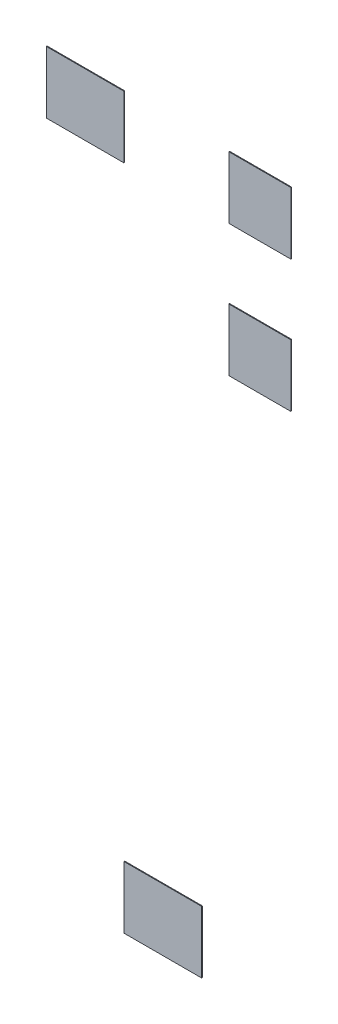
ISO-10303-21;
HEADER;
FILE_DESCRIPTION(('STEP AP214'),'2;1');
FILE_NAME('part.step','',(''),(''),'','','');
FILE_SCHEMA(('AUTOMOTIVE_DESIGN { 1 0 10303 214 1 1 1 1 }'));
ENDSEC;
DATA;
#1=APPLICATION_CONTEXT('core data for automotive mechanical design processes');
#2=APPLICATION_PROTOCOL_DEFINITION('international standard','automotive_design',2000,#1);
#3=PRODUCT_CONTEXT('',#1,'mechanical');
#4=PRODUCT('Part','Part','',(#3));
#5=PRODUCT_RELATED_PRODUCT_CATEGORY('part','',(#4));
#6=PRODUCT_DEFINITION_FORMATION('','',#4);
#7=PRODUCT_DEFINITION_CONTEXT('part definition',#1,'design');
#8=PRODUCT_DEFINITION('design','',#6,#7);
#9=PRODUCT_DEFINITION_SHAPE('','',#8);
#10=(LENGTH_UNIT() NAMED_UNIT(*) SI_UNIT(.MILLI.,.METRE.));
#11=(NAMED_UNIT(*) PLANE_ANGLE_UNIT() SI_UNIT($,.RADIAN.));
#12=(NAMED_UNIT(*) SI_UNIT($,.STERADIAN.) SOLID_ANGLE_UNIT());
#13=UNCERTAINTY_MEASURE_WITH_UNIT(LENGTH_MEASURE(1.E-05),#10,'distance_accuracy_value','');
#14=(GEOMETRIC_REPRESENTATION_CONTEXT(3) GLOBAL_UNCERTAINTY_ASSIGNED_CONTEXT((#13)) GLOBAL_UNIT_ASSIGNED_CONTEXT((#10,
#11,#12)) REPRESENTATION_CONTEXT('',''));
#15=CARTESIAN_POINT('',(0.,0.,0.));
#16=DIRECTION('',(0.,0.,1.));
#17=DIRECTION('',(1.,0.,0.));
#18=AXIS2_PLACEMENT_3D('',#15,#16,#17);
#19=CARTESIAN_POINT('',(-1.2,-2.,0.));
#20=DIRECTION('',(0.,0.,1.));
#21=DIRECTION('',(1.,0.,0.));
#22=AXIS2_PLACEMENT_3D('',#19,#20,#21);
#23=PLANE('',#22);
#24=DIRECTION('',(0.,1.,0.));
#25=VECTOR('',#24,1.);
#26=CARTESIAN_POINT('',(-0.4,-2.8,0.));
#27=LINE('',#26,#25);
#28=CARTESIAN_POINT('',(-0.4,-2.,0.));
#29=VERTEX_POINT('',#28);
#30=CARTESIAN_POINT('',(-0.4,-2.8,0.));
#31=VERTEX_POINT('',#30);
#32=EDGE_CURVE('P0_E81',#29,#31,#27,.F.);
#33=ORIENTED_EDGE('',*,*,#32,.T.);
#34=DIRECTION('',(1.,0.,0.));
#35=VECTOR('',#34,1.);
#36=CARTESIAN_POINT('',(-1.2,-2.8,0.));
#37=LINE('',#36,#35);
#38=CARTESIAN_POINT('',(-1.2,-2.8,0.));
#39=VERTEX_POINT('',#38);
#40=EDGE_CURVE('P0_E68',#31,#39,#37,.F.);
#41=ORIENTED_EDGE('',*,*,#40,.T.);
#42=DIRECTION('',(0.,1.,0.));
#43=VECTOR('',#42,1.);
#44=CARTESIAN_POINT('',(-1.2,-2.,0.));
#45=LINE('',#44,#43);
#46=CARTESIAN_POINT('',(-1.2,-2.,0.));
#47=VERTEX_POINT('',#46);
#48=EDGE_CURVE('P0_E55',#39,#47,#45,.T.);
#49=ORIENTED_EDGE('',*,*,#48,.T.);
#50=DIRECTION('',(1.,0.,0.));
#51=VECTOR('',#50,1.);
#52=CARTESIAN_POINT('',(-0.4,-2.,0.));
#53=LINE('',#52,#51);
#54=EDGE_CURVE('P0_E20',#47,#29,#53,.T.);
#55=ORIENTED_EDGE('',*,*,#54,.T.);
#56=EDGE_LOOP('',(#33,#41,#49,#55));
#57=FACE_BOUND('',#56,.T.);
#58=ADVANCED_FACE('P0_F17',(#57),#23,.F.);
#59=CARTESIAN_POINT('',(-0.4,-2.,0.01));
#60=DIRECTION('',(0.,-1.,0.));
#61=DIRECTION('',(0.,0.,-1.));
#62=AXIS2_PLACEMENT_3D('',#59,#60,#61);
#63=PLANE('',#62);
#64=DIRECTION('',(0.,0.,-1.));
#65=VECTOR('',#64,1.);
#66=CARTESIAN_POINT('',(-1.2,-2.,0.01));
#67=LINE('',#66,#65);
#68=CARTESIAN_POINT('',(-1.2,-2.,0.01));
#69=VERTEX_POINT('',#68);
#70=EDGE_CURVE('P0_E61',#47,#69,#67,.F.);
#71=ORIENTED_EDGE('',*,*,#70,.T.);
#72=DIRECTION('',(1.,0.,0.));
#73=VECTOR('',#72,1.);
#74=CARTESIAN_POINT('',(-1.2,-2.,0.01));
#75=LINE('',#74,#73);
#76=CARTESIAN_POINT('',(-0.4,-2.,0.01));
#77=VERTEX_POINT('',#76);
#78=EDGE_CURVE('P0_E83',#77,#69,#75,.F.);
#79=ORIENTED_EDGE('',*,*,#78,.F.);
#80=DIRECTION('',(0.,0.,1.));
#81=VECTOR('',#80,1.);
#82=CARTESIAN_POINT('',(-0.4,-2.,0.01));
#83=LINE('',#82,#81);
#84=EDGE_CURVE('P0_E64',#77,#29,#83,.F.);
#85=ORIENTED_EDGE('',*,*,#84,.T.);
#86=ORIENTED_EDGE('',*,*,#54,.F.);
#87=EDGE_LOOP('',(#71,#79,#85,#86));
#88=FACE_BOUND('',#87,.T.);
#89=ADVANCED_FACE('P0_F60',(#88),#63,.F.);
#90=CARTESIAN_POINT('',(-1.2,-2.,0.01));
#91=DIRECTION('',(1.,0.,0.));
#92=DIRECTION('',(0.,0.,-1.));
#93=AXIS2_PLACEMENT_3D('',#90,#91,#92);
#94=PLANE('',#93);
#95=DIRECTION('',(0.,0.,1.));
#96=VECTOR('',#95,1.);
#97=CARTESIAN_POINT('',(-1.2,-2.8,0.01));
#98=LINE('',#97,#96);
#99=CARTESIAN_POINT('',(-1.2,-2.8,0.01));
#100=VERTEX_POINT('',#99);
#101=EDGE_CURVE('P0_E70',#39,#100,#98,.T.);
#102=ORIENTED_EDGE('',*,*,#101,.T.);
#103=DIRECTION('',(0.,1.,0.));
#104=VECTOR('',#103,1.);
#105=CARTESIAN_POINT('',(-1.2,-2.,0.01));
#106=LINE('',#105,#104);
#107=EDGE_CURVE('P0_E74',#69,#100,#106,.F.);
#108=ORIENTED_EDGE('',*,*,#107,.F.);
#109=ORIENTED_EDGE('',*,*,#70,.F.);
#110=ORIENTED_EDGE('',*,*,#48,.F.);
#111=EDGE_LOOP('',(#102,#108,#109,#110));
#112=FACE_BOUND('',#111,.T.);
#113=ADVANCED_FACE('P0_F72',(#112),#94,.F.);
#114=CARTESIAN_POINT('',(-1.2,-2.8,0.01));
#115=DIRECTION('',(0.,1.,0.));
#116=DIRECTION('',(0.,0.,1.));
#117=AXIS2_PLACEMENT_3D('',#114,#115,#116);
#118=PLANE('',#117);
#119=DIRECTION('',(0.,0.,1.));
#120=VECTOR('',#119,1.);
#121=CARTESIAN_POINT('',(-0.4,-2.8,0.01));
#122=LINE('',#121,#120);
#123=CARTESIAN_POINT('',(-0.4,-2.8,0.01));
#124=VERTEX_POINT('',#123);
#125=EDGE_CURVE('P0_E35',#31,#124,#122,.T.);
#126=ORIENTED_EDGE('',*,*,#125,.T.);
#127=DIRECTION('',(1.,0.,0.));
#128=VECTOR('',#127,1.);
#129=CARTESIAN_POINT('',(-1.2,-2.8,0.01));
#130=LINE('',#129,#128);
#131=EDGE_CURVE('P0_E26',#100,#124,#130,.T.);
#132=ORIENTED_EDGE('',*,*,#131,.F.);
#133=ORIENTED_EDGE('',*,*,#101,.F.);
#134=ORIENTED_EDGE('',*,*,#40,.F.);
#135=EDGE_LOOP('',(#126,#132,#133,#134));
#136=FACE_BOUND('',#135,.T.);
#137=ADVANCED_FACE('P0_F89',(#136),#118,.F.);
#138=CARTESIAN_POINT('',(-0.4,-2.8,0.01));
#139=DIRECTION('',(-1.,0.,0.));
#140=DIRECTION('',(0.,0.,1.));
#141=AXIS2_PLACEMENT_3D('',#138,#139,#140);
#142=PLANE('',#141);
#143=ORIENTED_EDGE('',*,*,#84,.F.);
#144=DIRECTION('',(0.,1.,0.));
#145=VECTOR('',#144,1.);
#146=CARTESIAN_POINT('',(-0.4,-2.,0.01));
#147=LINE('',#146,#145);
#148=EDGE_CURVE('P0_E11',#124,#77,#147,.T.);
#149=ORIENTED_EDGE('',*,*,#148,.F.);
#150=ORIENTED_EDGE('',*,*,#125,.F.);
#151=ORIENTED_EDGE('',*,*,#32,.F.);
#152=EDGE_LOOP('',(#143,#149,#150,#151));
#153=FACE_BOUND('',#152,.T.);
#154=ADVANCED_FACE('P0_F91',(#153),#142,.F.);
#155=CARTESIAN_POINT('',(-1.2,-2.,0.01));
#156=DIRECTION('',(0.,0.,1.));
#157=DIRECTION('',(1.,0.,0.));
#158=AXIS2_PLACEMENT_3D('',#155,#156,#157);
#159=PLANE('',#158);
#160=ORIENTED_EDGE('',*,*,#131,.T.);
#161=ORIENTED_EDGE('',*,*,#148,.T.);
#162=ORIENTED_EDGE('',*,*,#78,.T.);
#163=ORIENTED_EDGE('',*,*,#107,.T.);
#164=EDGE_LOOP('',(#160,#161,#162,#163));
#165=FACE_BOUND('',#164,.T.);
#166=ADVANCED_FACE('P0_F88',(#165),#159,.T.);
#167=CLOSED_SHELL('',(#58,#89,#113,#137,#154,#166));
#168=MANIFOLD_SOLID_BREP('P0_B1',#167);
#169=CARTESIAN_POINT('',(-3.55,-1.1,0.001000000000015));
#170=DIRECTION('',(0.,0.,1.));
#171=DIRECTION('',(1.,0.,0.));
#172=AXIS2_PLACEMENT_3D('',#169,#170,#171);
#173=PLANE('',#172);
#174=DIRECTION('',(1.,0.,0.));
#175=VECTOR('',#174,1.);
#176=CARTESIAN_POINT('',(-2.55,-0.3,0.001000000000015));
#177=LINE('',#176,#175);
#178=CARTESIAN_POINT('',(-3.55,-0.3,0.001000000000015));
#179=VERTEX_POINT('',#178);
#180=CARTESIAN_POINT('',(-2.55,-0.3,0.001000000000015));
#181=VERTEX_POINT('',#180);
#182=EDGE_CURVE('P1_E81',#179,#181,#177,.T.);
#183=ORIENTED_EDGE('',*,*,#182,.T.);
#184=DIRECTION('',(0.,1.,0.));
#185=VECTOR('',#184,1.);
#186=CARTESIAN_POINT('',(-2.55,-1.1,0.001000000000015));
#187=LINE('',#186,#185);
#188=CARTESIAN_POINT('',(-2.55,-1.1,0.001000000000015));
#189=VERTEX_POINT('',#188);
#190=EDGE_CURVE('P1_E68',#181,#189,#187,.F.);
#191=ORIENTED_EDGE('',*,*,#190,.T.);
#192=DIRECTION('',(1.,0.,0.));
#193=VECTOR('',#192,1.);
#194=CARTESIAN_POINT('',(-3.55,-1.1,0.001000000000015));
#195=LINE('',#194,#193);
#196=CARTESIAN_POINT('',(-3.55,-1.1,0.001000000000015));
#197=VERTEX_POINT('',#196);
#198=EDGE_CURVE('P1_E55',#189,#197,#195,.F.);
#199=ORIENTED_EDGE('',*,*,#198,.T.);
#200=DIRECTION('',(0.,1.,0.));
#201=VECTOR('',#200,1.);
#202=CARTESIAN_POINT('',(-3.55,-0.3,0.001000000000015));
#203=LINE('',#202,#201);
#204=EDGE_CURVE('P1_E20',#197,#179,#203,.T.);
#205=ORIENTED_EDGE('',*,*,#204,.T.);
#206=EDGE_LOOP('',(#183,#191,#199,#205));
#207=FACE_BOUND('',#206,.T.);
#208=ADVANCED_FACE('P1_F17',(#207),#173,.F.);
#209=CARTESIAN_POINT('',(-3.55,-0.3,0.01100000000001));
#210=DIRECTION('',(1.,0.,0.));
#211=DIRECTION('',(0.,0.,-1.));
#212=AXIS2_PLACEMENT_3D('',#209,#210,#211);
#213=PLANE('',#212);
#214=DIRECTION('',(0.,0.,1.));
#215=VECTOR('',#214,1.);
#216=CARTESIAN_POINT('',(-3.55,-1.1,0.01100000000001));
#217=LINE('',#216,#215);
#218=CARTESIAN_POINT('',(-3.55,-1.1,0.01100000000001));
#219=VERTEX_POINT('',#218);
#220=EDGE_CURVE('P1_E61',#197,#219,#217,.T.);
#221=ORIENTED_EDGE('',*,*,#220,.T.);
#222=DIRECTION('',(0.,1.,0.));
#223=VECTOR('',#222,1.);
#224=CARTESIAN_POINT('',(-3.55,-1.1,0.01100000000001));
#225=LINE('',#224,#223);
#226=CARTESIAN_POINT('',(-3.55,-0.3,0.01100000000001));
#227=VERTEX_POINT('',#226);
#228=EDGE_CURVE('P1_E83',#227,#219,#225,.F.);
#229=ORIENTED_EDGE('',*,*,#228,.F.);
#230=DIRECTION('',(0.,0.,-1.));
#231=VECTOR('',#230,1.);
#232=CARTESIAN_POINT('',(-3.55,-0.3,0.01100000000001));
#233=LINE('',#232,#231);
#234=EDGE_CURVE('P1_E64',#227,#179,#233,.T.);
#235=ORIENTED_EDGE('',*,*,#234,.T.);
#236=ORIENTED_EDGE('',*,*,#204,.F.);
#237=EDGE_LOOP('',(#221,#229,#235,#236));
#238=FACE_BOUND('',#237,.T.);
#239=ADVANCED_FACE('P1_F60',(#238),#213,.F.);
#240=CARTESIAN_POINT('',(-3.55,-1.1,0.01100000000001));
#241=DIRECTION('',(0.,1.,0.));
#242=DIRECTION('',(0.,0.,1.));
#243=AXIS2_PLACEMENT_3D('',#240,#241,#242);
#244=PLANE('',#243);
#245=DIRECTION('',(0.,0.,1.));
#246=VECTOR('',#245,1.);
#247=CARTESIAN_POINT('',(-2.55,-1.1,0.01100000000001));
#248=LINE('',#247,#246);
#249=CARTESIAN_POINT('',(-2.55,-1.1,0.01100000000001));
#250=VERTEX_POINT('',#249);
#251=EDGE_CURVE('P1_E70',#189,#250,#248,.T.);
#252=ORIENTED_EDGE('',*,*,#251,.T.);
#253=DIRECTION('',(1.,0.,0.));
#254=VECTOR('',#253,1.);
#255=CARTESIAN_POINT('',(-3.55,-1.1,0.01100000000001));
#256=LINE('',#255,#254);
#257=EDGE_CURVE('P1_E74',#219,#250,#256,.T.);
#258=ORIENTED_EDGE('',*,*,#257,.F.);
#259=ORIENTED_EDGE('',*,*,#220,.F.);
#260=ORIENTED_EDGE('',*,*,#198,.F.);
#261=EDGE_LOOP('',(#252,#258,#259,#260));
#262=FACE_BOUND('',#261,.T.);
#263=ADVANCED_FACE('P1_F72',(#262),#244,.F.);
#264=CARTESIAN_POINT('',(-2.55,-1.1,0.01100000000001));
#265=DIRECTION('',(-1.,0.,0.));
#266=DIRECTION('',(0.,0.,1.));
#267=AXIS2_PLACEMENT_3D('',#264,#265,#266);
#268=PLANE('',#267);
#269=DIRECTION('',(0.,0.,-1.));
#270=VECTOR('',#269,1.);
#271=CARTESIAN_POINT('',(-2.55,-0.3,0.01100000000001));
#272=LINE('',#271,#270);
#273=CARTESIAN_POINT('',(-2.55,-0.3,0.01100000000001));
#274=VERTEX_POINT('',#273);
#275=EDGE_CURVE('P1_E35',#181,#274,#272,.F.);
#276=ORIENTED_EDGE('',*,*,#275,.T.);
#277=DIRECTION('',(0.,1.,0.));
#278=VECTOR('',#277,1.);
#279=CARTESIAN_POINT('',(-2.55,-1.1,0.01100000000001));
#280=LINE('',#279,#278);
#281=EDGE_CURVE('P1_E26',#250,#274,#280,.T.);
#282=ORIENTED_EDGE('',*,*,#281,.F.);
#283=ORIENTED_EDGE('',*,*,#251,.F.);
#284=ORIENTED_EDGE('',*,*,#190,.F.);
#285=EDGE_LOOP('',(#276,#282,#283,#284));
#286=FACE_BOUND('',#285,.T.);
#287=ADVANCED_FACE('P1_F89',(#286),#268,.F.);
#288=CARTESIAN_POINT('',(-2.55,-0.3,0.01100000000001));
#289=DIRECTION('',(0.,-1.,0.));
#290=DIRECTION('',(0.,0.,-1.));
#291=AXIS2_PLACEMENT_3D('',#288,#289,#290);
#292=PLANE('',#291);
#293=ORIENTED_EDGE('',*,*,#234,.F.);
#294=DIRECTION('',(1.,0.,0.));
#295=VECTOR('',#294,1.);
#296=CARTESIAN_POINT('',(-3.55,-0.3,0.01100000000001));
#297=LINE('',#296,#295);
#298=EDGE_CURVE('P1_E11',#274,#227,#297,.F.);
#299=ORIENTED_EDGE('',*,*,#298,.F.);
#300=ORIENTED_EDGE('',*,*,#275,.F.);
#301=ORIENTED_EDGE('',*,*,#182,.F.);
#302=EDGE_LOOP('',(#293,#299,#300,#301));
#303=FACE_BOUND('',#302,.T.);
#304=ADVANCED_FACE('P1_F91',(#303),#292,.F.);
#305=CARTESIAN_POINT('',(-3.55,-1.1,0.01100000000001));
#306=DIRECTION('',(0.,0.,1.));
#307=DIRECTION('',(1.,0.,0.));
#308=AXIS2_PLACEMENT_3D('',#305,#306,#307);
#309=PLANE('',#308);
#310=ORIENTED_EDGE('',*,*,#281,.T.);
#311=ORIENTED_EDGE('',*,*,#298,.T.);
#312=ORIENTED_EDGE('',*,*,#228,.T.);
#313=ORIENTED_EDGE('',*,*,#257,.T.);
#314=EDGE_LOOP('',(#310,#311,#312,#313));
#315=FACE_BOUND('',#314,.T.);
#316=ADVANCED_FACE('P1_F88',(#315),#309,.T.);
#317=CLOSED_SHELL('',(#208,#239,#263,#287,#304,#316));
#318=MANIFOLD_SOLID_BREP('P1_B1',#317);
#319=CARTESIAN_POINT('',(-1.2,-0.3,0.01));
#320=DIRECTION('',(0.,0.,1.));
#321=DIRECTION('',(1.,0.,0.));
#322=AXIS2_PLACEMENT_3D('',#319,#320,#321);
#323=PLANE('',#322);
#324=DIRECTION('',(1.,0.,0.));
#325=VECTOR('',#324,1.);
#326=CARTESIAN_POINT('',(-1.2,-1.1,0.01));
#327=LINE('',#326,#325);
#328=CARTESIAN_POINT('',(-1.2,-1.1,0.01));
#329=VERTEX_POINT('',#328);
#330=CARTESIAN_POINT('',(-0.4,-1.1,0.01));
#331=VERTEX_POINT('',#330);
#332=EDGE_CURVE('P2_E55',#329,#331,#327,.T.);
#333=ORIENTED_EDGE('',*,*,#332,.T.);
#334=DIRECTION('',(0.,1.,0.));
#335=VECTOR('',#334,1.);
#336=CARTESIAN_POINT('',(-0.4,-1.1,0.01));
#337=LINE('',#336,#335);
#338=CARTESIAN_POINT('',(-0.4,-0.3,0.01));
#339=VERTEX_POINT('',#338);
#340=EDGE_CURVE('P2_E76',#331,#339,#337,.T.);
#341=ORIENTED_EDGE('',*,*,#340,.T.);
#342=DIRECTION('',(1.,0.,0.));
#343=VECTOR('',#342,1.);
#344=CARTESIAN_POINT('',(-0.4,-0.3,0.01));
#345=LINE('',#344,#343);
#346=CARTESIAN_POINT('',(-1.2,-0.3,0.01));
#347=VERTEX_POINT('',#346);
#348=EDGE_CURVE('P2_E58',#339,#347,#345,.F.);
#349=ORIENTED_EDGE('',*,*,#348,.T.);
#350=DIRECTION('',(0.,1.,0.));
#351=VECTOR('',#350,1.);
#352=CARTESIAN_POINT('',(-1.2,-0.3,0.01));
#353=LINE('',#352,#351);
#354=EDGE_CURVE('P2_E20',#347,#329,#353,.F.);
#355=ORIENTED_EDGE('',*,*,#354,.T.);
#356=EDGE_LOOP('',(#333,#341,#349,#355));
#357=FACE_BOUND('',#356,.T.);
#358=ADVANCED_FACE('P2_F17',(#357),#323,.T.);
#359=CARTESIAN_POINT('',(-1.2,-0.3,0.01));
#360=DIRECTION('',(1.,0.,0.));
#361=DIRECTION('',(0.,0.,-1.));
#362=AXIS2_PLACEMENT_3D('',#359,#360,#361);
#363=PLANE('',#362);
#364=DIRECTION('',(0.,0.,1.));
#365=VECTOR('',#364,1.);
#366=CARTESIAN_POINT('',(-1.2,-1.1,0.01));
#367=LINE('',#366,#365);
#368=CARTESIAN_POINT('',(-1.2,-1.1,0.));
#369=VERTEX_POINT('',#368);
#370=EDGE_CURVE('P2_E63',#369,#329,#367,.T.);
#371=ORIENTED_EDGE('',*,*,#370,.T.);
#372=ORIENTED_EDGE('',*,*,#354,.F.);
#373=DIRECTION('',(0.,0.,-1.));
#374=VECTOR('',#373,1.);
#375=CARTESIAN_POINT('',(-1.2,-0.3,0.01));
#376=LINE('',#375,#374);
#377=CARTESIAN_POINT('',(-1.2,-0.3,0.));
#378=VERTEX_POINT('',#377);
#379=EDGE_CURVE('P2_E80',#347,#378,#376,.T.);
#380=ORIENTED_EDGE('',*,*,#379,.T.);
#381=DIRECTION('',(0.,1.,0.));
#382=VECTOR('',#381,1.);
#383=CARTESIAN_POINT('',(-1.2,-0.3,0.));
#384=LINE('',#383,#382);
#385=EDGE_CURVE('P2_E73',#378,#369,#384,.F.);
#386=ORIENTED_EDGE('',*,*,#385,.T.);
#387=EDGE_LOOP('',(#371,#372,#380,#386));
#388=FACE_BOUND('',#387,.T.);
#389=ADVANCED_FACE('P2_F72',(#388),#363,.F.);
#390=CARTESIAN_POINT('',(-1.2,-1.1,0.01));
#391=DIRECTION('',(0.,1.,0.));
#392=DIRECTION('',(0.,0.,1.));
#393=AXIS2_PLACEMENT_3D('',#390,#391,#392);
#394=PLANE('',#393);
#395=DIRECTION('',(0.,0.,1.));
#396=VECTOR('',#395,1.);
#397=CARTESIAN_POINT('',(-0.4,-1.1,0.01));
#398=LINE('',#397,#396);
#399=CARTESIAN_POINT('',(-0.4,-1.1,0.));
#400=VERTEX_POINT('',#399);
#401=EDGE_CURVE('P2_E69',#400,#331,#398,.T.);
#402=ORIENTED_EDGE('',*,*,#401,.T.);
#403=ORIENTED_EDGE('',*,*,#332,.F.);
#404=ORIENTED_EDGE('',*,*,#370,.F.);
#405=DIRECTION('',(1.,0.,0.));
#406=VECTOR('',#405,1.);
#407=CARTESIAN_POINT('',(-1.2,-1.1,0.));
#408=LINE('',#407,#406);
#409=EDGE_CURVE('P2_E83',#369,#400,#408,.T.);
#410=ORIENTED_EDGE('',*,*,#409,.T.);
#411=EDGE_LOOP('',(#402,#403,#404,#410));
#412=FACE_BOUND('',#411,.T.);
#413=ADVANCED_FACE('P2_F66',(#412),#394,.F.);
#414=CARTESIAN_POINT('',(-0.4,-1.1,0.01));
#415=DIRECTION('',(-1.,0.,0.));
#416=DIRECTION('',(0.,0.,1.));
#417=AXIS2_PLACEMENT_3D('',#414,#415,#416);
#418=PLANE('',#417);
#419=DIRECTION('',(0.,0.,-1.));
#420=VECTOR('',#419,1.);
#421=CARTESIAN_POINT('',(-0.4,-0.3,0.01));
#422=LINE('',#421,#420);
#423=CARTESIAN_POINT('',(-0.4,-0.3,0.));
#424=VERTEX_POINT('',#423);
#425=EDGE_CURVE('P2_E34',#424,#339,#422,.F.);
#426=ORIENTED_EDGE('',*,*,#425,.T.);
#427=ORIENTED_EDGE('',*,*,#340,.F.);
#428=ORIENTED_EDGE('',*,*,#401,.F.);
#429=DIRECTION('',(0.,1.,0.));
#430=VECTOR('',#429,1.);
#431=CARTESIAN_POINT('',(-0.4,-0.3,0.));
#432=LINE('',#431,#430);
#433=EDGE_CURVE('P2_E26',#400,#424,#432,.T.);
#434=ORIENTED_EDGE('',*,*,#433,.T.);
#435=EDGE_LOOP('',(#426,#427,#428,#434));
#436=FACE_BOUND('',#435,.T.);
#437=ADVANCED_FACE('P2_F88',(#436),#418,.F.);
#438=CARTESIAN_POINT('',(-0.4,-0.3,0.01));
#439=DIRECTION('',(0.,-1.,0.));
#440=DIRECTION('',(0.,0.,-1.));
#441=AXIS2_PLACEMENT_3D('',#438,#439,#440);
#442=PLANE('',#441);
#443=ORIENTED_EDGE('',*,*,#379,.F.);
#444=ORIENTED_EDGE('',*,*,#348,.F.);
#445=ORIENTED_EDGE('',*,*,#425,.F.);
#446=DIRECTION('',(1.,0.,0.));
#447=VECTOR('',#446,1.);
#448=CARTESIAN_POINT('',(-1.2,-0.3,0.));
#449=LINE('',#448,#447);
#450=EDGE_CURVE('P2_E11',#424,#378,#449,.F.);
#451=ORIENTED_EDGE('',*,*,#450,.T.);
#452=EDGE_LOOP('',(#443,#444,#445,#451));
#453=FACE_BOUND('',#452,.T.);
#454=ADVANCED_FACE('P2_F91',(#453),#442,.F.);
#455=CARTESIAN_POINT('',(-1.2,-0.3,0.));
#456=DIRECTION('',(0.,0.,1.));
#457=DIRECTION('',(1.,0.,0.));
#458=AXIS2_PLACEMENT_3D('',#455,#456,#457);
#459=PLANE('',#458);
#460=ORIENTED_EDGE('',*,*,#433,.F.);
#461=ORIENTED_EDGE('',*,*,#409,.F.);
#462=ORIENTED_EDGE('',*,*,#385,.F.);
#463=ORIENTED_EDGE('',*,*,#450,.F.);
#464=EDGE_LOOP('',(#460,#461,#462,#463));
#465=FACE_BOUND('',#464,.T.);
#466=ADVANCED_FACE('P2_F90',(#465),#459,.F.);
#467=CLOSED_SHELL('',(#358,#389,#413,#437,#454,#466));
#468=MANIFOLD_SOLID_BREP('P2_B1',#467);
#469=CARTESIAN_POINT('',(-2.549999999953,-9.7,0.01));
#470=DIRECTION('',(0.,0.,1.));
#471=DIRECTION('',(1.,0.,0.));
#472=AXIS2_PLACEMENT_3D('',#469,#470,#471);
#473=PLANE('',#472);
#474=DIRECTION('',(0.,1.,0.));
#475=VECTOR('',#474,1.);
#476=CARTESIAN_POINT('',(-1.549999999953,-9.7,0.01));
#477=LINE('',#476,#475);
#478=CARTESIAN_POINT('',(-1.549999999953,-9.7,0.01));
#479=VERTEX_POINT('',#478);
#480=CARTESIAN_POINT('',(-1.549999999953,-8.9,0.01));
#481=VERTEX_POINT('',#480);
#482=EDGE_CURVE('P3_E55',#479,#481,#477,.T.);
#483=ORIENTED_EDGE('',*,*,#482,.T.);
#484=DIRECTION('',(1.,0.,0.));
#485=VECTOR('',#484,1.);
#486=CARTESIAN_POINT('',(-1.549999999953,-8.9,0.01));
#487=LINE('',#486,#485);
#488=CARTESIAN_POINT('',(-2.549999999953,-8.9,0.01));
#489=VERTEX_POINT('',#488);
#490=EDGE_CURVE('P3_E76',#481,#489,#487,.F.);
#491=ORIENTED_EDGE('',*,*,#490,.T.);
#492=DIRECTION('',(0.,1.,0.));
#493=VECTOR('',#492,1.);
#494=CARTESIAN_POINT('',(-2.549999999953,-8.9,0.01));
#495=LINE('',#494,#493);
#496=CARTESIAN_POINT('',(-2.549999999953,-9.7,0.01));
#497=VERTEX_POINT('',#496);
#498=EDGE_CURVE('P3_E58',#489,#497,#495,.F.);
#499=ORIENTED_EDGE('',*,*,#498,.T.);
#500=DIRECTION('',(1.,0.,0.));
#501=VECTOR('',#500,1.);
#502=CARTESIAN_POINT('',(-2.549999999953,-9.7,0.01));
#503=LINE('',#502,#501);
#504=EDGE_CURVE('P3_E20',#497,#479,#503,.T.);
#505=ORIENTED_EDGE('',*,*,#504,.T.);
#506=EDGE_LOOP('',(#483,#491,#499,#505));
#507=FACE_BOUND('',#506,.T.);
#508=ADVANCED_FACE('P3_F17',(#507),#473,.T.);
#509=CARTESIAN_POINT('',(-2.549999999953,-9.7,0.01));
#510=DIRECTION('',(0.,1.,0.));
#511=DIRECTION('',(0.,0.,1.));
#512=AXIS2_PLACEMENT_3D('',#509,#510,#511);
#513=PLANE('',#512);
#514=DIRECTION('',(0.,0.,1.));
#515=VECTOR('',#514,1.);
#516=CARTESIAN_POINT('',(-1.549999999953,-9.7,0.01));
#517=LINE('',#516,#515);
#518=CARTESIAN_POINT('',(-1.549999999953,-9.7,0.));
#519=VERTEX_POINT('',#518);
#520=EDGE_CURVE('P3_E63',#519,#479,#517,.T.);
#521=ORIENTED_EDGE('',*,*,#520,.T.);
#522=ORIENTED_EDGE('',*,*,#504,.F.);
#523=DIRECTION('',(0.,0.,-1.));
#524=VECTOR('',#523,1.);
#525=CARTESIAN_POINT('',(-2.549999999953,-9.7,0.01));
#526=LINE('',#525,#524);
#527=CARTESIAN_POINT('',(-2.549999999953,-9.7,0.));
#528=VERTEX_POINT('',#527);
#529=EDGE_CURVE('P3_E80',#497,#528,#526,.T.);
#530=ORIENTED_EDGE('',*,*,#529,.T.);
#531=DIRECTION('',(1.,0.,0.));
#532=VECTOR('',#531,1.);
#533=CARTESIAN_POINT('',(-2.549999999953,-9.7,0.));
#534=LINE('',#533,#532);
#535=EDGE_CURVE('P3_E73',#528,#519,#534,.T.);
#536=ORIENTED_EDGE('',*,*,#535,.T.);
#537=EDGE_LOOP('',(#521,#522,#530,#536));
#538=FACE_BOUND('',#537,.T.);
#539=ADVANCED_FACE('P3_F72',(#538),#513,.F.);
#540=CARTESIAN_POINT('',(-1.549999999953,-9.7,0.01));
#541=DIRECTION('',(-1.,0.,0.));
#542=DIRECTION('',(0.,0.,1.));
#543=AXIS2_PLACEMENT_3D('',#540,#541,#542);
#544=PLANE('',#543);
#545=DIRECTION('',(0.,0.,-1.));
#546=VECTOR('',#545,1.);
#547=CARTESIAN_POINT('',(-1.549999999953,-8.9,0.01));
#548=LINE('',#547,#546);
#549=CARTESIAN_POINT('',(-1.549999999953,-8.9,0.));
#550=VERTEX_POINT('',#549);
#551=EDGE_CURVE('P3_E69',#550,#481,#548,.F.);
#552=ORIENTED_EDGE('',*,*,#551,.T.);
#553=ORIENTED_EDGE('',*,*,#482,.F.);
#554=ORIENTED_EDGE('',*,*,#520,.F.);
#555=DIRECTION('',(0.,1.,0.));
#556=VECTOR('',#555,1.);
#557=CARTESIAN_POINT('',(-1.549999999953,-9.7,0.));
#558=LINE('',#557,#556);
#559=EDGE_CURVE('P3_E83',#519,#550,#558,.T.);
#560=ORIENTED_EDGE('',*,*,#559,.T.);
#561=EDGE_LOOP('',(#552,#553,#554,#560));
#562=FACE_BOUND('',#561,.T.);
#563=ADVANCED_FACE('P3_F66',(#562),#544,.F.);
#564=CARTESIAN_POINT('',(-1.549999999953,-8.9,0.01));
#565=DIRECTION('',(0.,-1.,0.));
#566=DIRECTION('',(0.,0.,-1.));
#567=AXIS2_PLACEMENT_3D('',#564,#565,#566);
#568=PLANE('',#567);
#569=DIRECTION('',(0.,0.,-1.));
#570=VECTOR('',#569,1.);
#571=CARTESIAN_POINT('',(-2.549999999953,-8.9,0.01));
#572=LINE('',#571,#570);
#573=CARTESIAN_POINT('',(-2.549999999953,-8.9,0.));
#574=VERTEX_POINT('',#573);
#575=EDGE_CURVE('P3_E34',#574,#489,#572,.F.);
#576=ORIENTED_EDGE('',*,*,#575,.T.);
#577=ORIENTED_EDGE('',*,*,#490,.F.);
#578=ORIENTED_EDGE('',*,*,#551,.F.);
#579=DIRECTION('',(1.,0.,0.));
#580=VECTOR('',#579,1.);
#581=CARTESIAN_POINT('',(-2.549999999953,-8.9,0.));
#582=LINE('',#581,#580);
#583=EDGE_CURVE('P3_E26',#550,#574,#582,.F.);
#584=ORIENTED_EDGE('',*,*,#583,.T.);
#585=EDGE_LOOP('',(#576,#577,#578,#584));
#586=FACE_BOUND('',#585,.T.);
#587=ADVANCED_FACE('P3_F88',(#586),#568,.F.);
#588=CARTESIAN_POINT('',(-2.549999999953,-8.9,0.01));
#589=DIRECTION('',(1.,0.,0.));
#590=DIRECTION('',(0.,0.,-1.));
#591=AXIS2_PLACEMENT_3D('',#588,#589,#590);
#592=PLANE('',#591);
#593=ORIENTED_EDGE('',*,*,#529,.F.);
#594=ORIENTED_EDGE('',*,*,#498,.F.);
#595=ORIENTED_EDGE('',*,*,#575,.F.);
#596=DIRECTION('',(0.,1.,0.));
#597=VECTOR('',#596,1.);
#598=CARTESIAN_POINT('',(-2.549999999953,-9.7,0.));
#599=LINE('',#598,#597);
#600=EDGE_CURVE('P3_E11',#574,#528,#599,.F.);
#601=ORIENTED_EDGE('',*,*,#600,.T.);
#602=EDGE_LOOP('',(#593,#594,#595,#601));
#603=FACE_BOUND('',#602,.T.);
#604=ADVANCED_FACE('P3_F91',(#603),#592,.F.);
#605=CARTESIAN_POINT('',(-2.549999999953,-9.7,0.));
#606=DIRECTION('',(0.,0.,1.));
#607=DIRECTION('',(1.,0.,0.));
#608=AXIS2_PLACEMENT_3D('',#605,#606,#607);
#609=PLANE('',#608);
#610=ORIENTED_EDGE('',*,*,#583,.F.);
#611=ORIENTED_EDGE('',*,*,#559,.F.);
#612=ORIENTED_EDGE('',*,*,#535,.F.);
#613=ORIENTED_EDGE('',*,*,#600,.F.);
#614=EDGE_LOOP('',(#610,#611,#612,#613));
#615=FACE_BOUND('',#614,.T.);
#616=ADVANCED_FACE('P3_F90',(#615),#609,.F.);
#617=CLOSED_SHELL('',(#508,#539,#563,#587,#604,#616));
#618=MANIFOLD_SOLID_BREP('P3_B1',#617);
#619=ADVANCED_BREP_SHAPE_REPRESENTATION('',(#18,#168,#318,#468,#618),#14);
#620=SHAPE_DEFINITION_REPRESENTATION(#9,#619);
ENDSEC;
END-ISO-10303-21;
